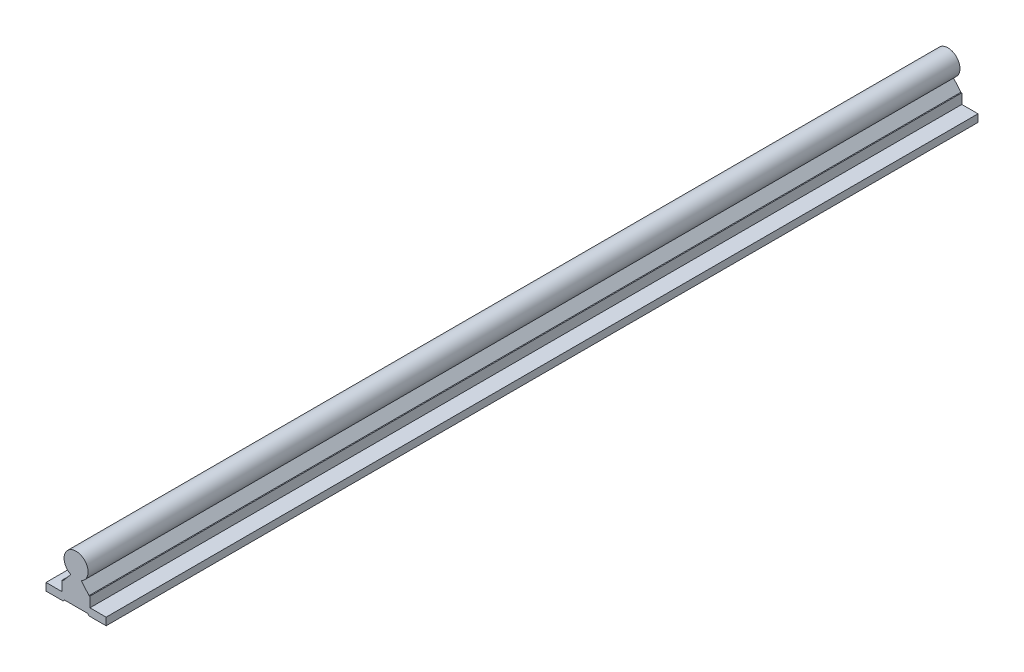
ISO-10303-21;
HEADER;
FILE_DESCRIPTION(('STEP AP214'),'2;1');
FILE_NAME('part.step','',(''),(''),'','','');
FILE_SCHEMA(('AUTOMOTIVE_DESIGN { 1 0 10303 214 1 1 1 1 }'));
ENDSEC;
DATA;
#1=APPLICATION_CONTEXT('core data for automotive mechanical design processes');
#2=APPLICATION_PROTOCOL_DEFINITION('international standard','automotive_design',2000,#1);
#3=PRODUCT_CONTEXT('',#1,'mechanical');
#4=PRODUCT('Part','Part','',(#3));
#5=PRODUCT_RELATED_PRODUCT_CATEGORY('part','',(#4));
#6=PRODUCT_DEFINITION_FORMATION('','',#4);
#7=PRODUCT_DEFINITION_CONTEXT('part definition',#1,'design');
#8=PRODUCT_DEFINITION('design','',#6,#7);
#9=PRODUCT_DEFINITION_SHAPE('','',#8);
#10=(LENGTH_UNIT() NAMED_UNIT(*) SI_UNIT(.MILLI.,.METRE.));
#11=(NAMED_UNIT(*) PLANE_ANGLE_UNIT() SI_UNIT($,.RADIAN.));
#12=(NAMED_UNIT(*) SI_UNIT($,.STERADIAN.) SOLID_ANGLE_UNIT());
#13=UNCERTAINTY_MEASURE_WITH_UNIT(LENGTH_MEASURE(1.E-05),#10,'distance_accuracy_value','');
#14=(GEOMETRIC_REPRESENTATION_CONTEXT(3) GLOBAL_UNCERTAINTY_ASSIGNED_CONTEXT((#13)) GLOBAL_UNIT_ASSIGNED_CONTEXT((#10,
#11,#12)) REPRESENTATION_CONTEXT('',''));
#15=CARTESIAN_POINT('',(0.,0.,0.));
#16=DIRECTION('',(0.,0.,1.));
#17=DIRECTION('',(1.,0.,0.));
#18=AXIS2_PLACEMENT_3D('',#15,#16,#17);
#19=CARTESIAN_POINT('',(0.,25.,580.));
#20=DIRECTION('',(0.,0.,-1.));
#21=DIRECTION('',(-1.,0.,0.));
#22=AXIS2_PLACEMENT_3D('',#19,#20,#21);
#23=CYLINDRICAL_SURFACE('',#22,8.);
#24=CARTESIAN_POINT('',(0.,25.,0.));
#25=DIRECTION('',(0.,0.,1.));
#26=DIRECTION('',(1.,0.,0.));
#27=AXIS2_PLACEMENT_3D('',#24,#25,#26);
#28=CIRCLE('',#27,8.);
#29=CARTESIAN_POINT('',(3.48711915483254,17.8,0.));
#30=VERTEX_POINT('',#29);
#31=CARTESIAN_POINT('',(-3.48711915483254,17.8,0.));
#32=VERTEX_POINT('',#31);
#33=EDGE_CURVE('E179',#30,#32,#28,.T.);
#34=ORIENTED_EDGE('',*,*,#33,.T.);
#35=DIRECTION('',(0.,0.,-1.));
#36=VECTOR('',#35,1.);
#37=CARTESIAN_POINT('',(-3.48711915483254,17.8,580.));
#38=LINE('',#37,#36);
#39=CARTESIAN_POINT('',(-3.48711915483254,17.8,580.));
#40=VERTEX_POINT('',#39);
#41=EDGE_CURVE('E11',#40,#32,#38,.T.);
#42=ORIENTED_EDGE('',*,*,#41,.F.);
#43=CARTESIAN_POINT('',(0.,25.,580.));
#44=DIRECTION('',(0.,0.,1.));
#45=DIRECTION('',(1.,0.,0.));
#46=AXIS2_PLACEMENT_3D('',#43,#44,#45);
#47=CIRCLE('',#46,8.);
#48=CARTESIAN_POINT('',(3.48711915483254,17.8,580.));
#49=VERTEX_POINT('',#48);
#50=EDGE_CURVE('E209',#49,#40,#47,.T.);
#51=ORIENTED_EDGE('',*,*,#50,.F.);
#52=DIRECTION('',(0.,0.,-1.));
#53=VECTOR('',#52,1.);
#54=CARTESIAN_POINT('',(3.48711915483254,17.8,580.));
#55=LINE('',#54,#53);
#56=EDGE_CURVE('E175',#49,#30,#55,.T.);
#57=ORIENTED_EDGE('',*,*,#56,.T.);
#58=EDGE_LOOP('',(#34,#42,#51,#57));
#59=FACE_BOUND('',#58,.T.);
#60=ADVANCED_FACE('F35',(#59),#23,.T.);
#61=CARTESIAN_POINT('',(-3.48711915483254,17.8,580.));
#62=DIRECTION('',(0.766044443118977,-0.642787609686541,0.));
#63=DIRECTION('',(0.642787609686541,0.766044443118977,0.));
#64=AXIS2_PLACEMENT_3D('',#61,#62,#63);
#65=PLANE('',#64);
#66=DIRECTION('',(-0.64278760968654,-0.766044443118977,0.));
#67=VECTOR('',#66,1.);
#68=CARTESIAN_POINT('',(-3.48711915483254,17.8,0.));
#69=LINE('',#68,#67);
#70=CARTESIAN_POINT('',(-8.60562690501396,11.7,0.));
#71=VERTEX_POINT('',#70);
#72=EDGE_CURVE('E182',#32,#71,#69,.T.);
#73=ORIENTED_EDGE('',*,*,#72,.T.);
#74=DIRECTION('',(0.,0.,-1.));
#75=VECTOR('',#74,1.);
#76=CARTESIAN_POINT('',(-8.60562690501396,11.7,580.));
#77=LINE('',#76,#75);
#78=CARTESIAN_POINT('',(-8.60562690501396,11.7,580.));
#79=VERTEX_POINT('',#78);
#80=EDGE_CURVE('E43',#79,#71,#77,.T.);
#81=ORIENTED_EDGE('',*,*,#80,.F.);
#82=DIRECTION('',(-0.64278760968654,-0.766044443118977,0.));
#83=VECTOR('',#82,1.);
#84=CARTESIAN_POINT('',(-3.48711915483254,17.8,580.));
#85=LINE('',#84,#83);
#86=EDGE_CURVE('E118',#40,#79,#85,.T.);
#87=ORIENTED_EDGE('',*,*,#86,.F.);
#88=ORIENTED_EDGE('',*,*,#41,.T.);
#89=EDGE_LOOP('',(#73,#81,#87,#88));
#90=FACE_BOUND('',#89,.T.);
#91=ADVANCED_FACE('F307',(#90),#65,.F.);
#92=CARTESIAN_POINT('',(-8.60562690501396,11.7,580.));
#93=DIRECTION('',(0.,-1.,0.));
#94=DIRECTION('',(0.,0.,-1.));
#95=AXIS2_PLACEMENT_3D('',#92,#93,#94);
#96=PLANE('',#95);
#97=DIRECTION('',(-1.,0.,0.));
#98=VECTOR('',#97,1.);
#99=CARTESIAN_POINT('',(-8.60562690501396,11.7,0.));
#100=LINE('',#99,#98);
#101=CARTESIAN_POINT('',(-9.25,11.7,0.));
#102=VERTEX_POINT('',#101);
#103=EDGE_CURVE('E184',#71,#102,#100,.T.);
#104=ORIENTED_EDGE('',*,*,#103,.T.);
#105=DIRECTION('',(0.,0.,-1.));
#106=VECTOR('',#105,1.);
#107=CARTESIAN_POINT('',(-9.25,11.7,580.));
#108=LINE('',#107,#106);
#109=CARTESIAN_POINT('',(-9.25,11.7,580.));
#110=VERTEX_POINT('',#109);
#111=EDGE_CURVE('E240',#110,#102,#108,.T.);
#112=ORIENTED_EDGE('',*,*,#111,.F.);
#113=DIRECTION('',(-1.,0.,0.));
#114=VECTOR('',#113,1.);
#115=CARTESIAN_POINT('',(-8.60562690501396,11.7,580.));
#116=LINE('',#115,#114);
#117=EDGE_CURVE('E248',#79,#110,#116,.T.);
#118=ORIENTED_EDGE('',*,*,#117,.F.);
#119=ORIENTED_EDGE('',*,*,#80,.T.);
#120=EDGE_LOOP('',(#104,#112,#118,#119));
#121=FACE_BOUND('',#120,.T.);
#122=ADVANCED_FACE('F246',(#121),#96,.F.);
#123=CARTESIAN_POINT('',(-9.25,11.7,580.));
#124=DIRECTION('',(1.,0.,0.));
#125=DIRECTION('',(0.,0.,-1.));
#126=AXIS2_PLACEMENT_3D('',#123,#124,#125);
#127=PLANE('',#126);
#128=DIRECTION('',(0.,-1.,0.));
#129=VECTOR('',#128,1.);
#130=CARTESIAN_POINT('',(-9.25,11.7,0.));
#131=LINE('',#130,#129);
#132=CARTESIAN_POINT('',(-9.25,5.,0.));
#133=VERTEX_POINT('',#132);
#134=EDGE_CURVE('E186',#102,#133,#131,.T.);
#135=ORIENTED_EDGE('',*,*,#134,.T.);
#136=DIRECTION('',(0.,0.,-1.));
#137=VECTOR('',#136,1.);
#138=CARTESIAN_POINT('',(-9.25,5.,580.));
#139=LINE('',#138,#137);
#140=CARTESIAN_POINT('',(-9.25,5.,580.));
#141=VERTEX_POINT('',#140);
#142=EDGE_CURVE('E237',#141,#133,#139,.T.);
#143=ORIENTED_EDGE('',*,*,#142,.F.);
#144=DIRECTION('',(0.,-1.,0.));
#145=VECTOR('',#144,1.);
#146=CARTESIAN_POINT('',(-9.25,11.7,580.));
#147=LINE('',#146,#145);
#148=EDGE_CURVE('E266',#110,#141,#147,.T.);
#149=ORIENTED_EDGE('',*,*,#148,.F.);
#150=ORIENTED_EDGE('',*,*,#111,.T.);
#151=EDGE_LOOP('',(#135,#143,#149,#150));
#152=FACE_BOUND('',#151,.T.);
#153=ADVANCED_FACE('F257',(#152),#127,.F.);
#154=CARTESIAN_POINT('',(-9.25,5.,580.));
#155=DIRECTION('',(0.,-1.,0.));
#156=DIRECTION('',(1.,0.,0.));
#157=AXIS2_PLACEMENT_3D('',#154,#155,#156);
#158=PLANE('',#157);
#159=DIRECTION('',(-1.,0.,0.));
#160=VECTOR('',#159,1.);
#161=CARTESIAN_POINT('',(-9.25,5.,0.));
#162=LINE('',#161,#160);
#163=CARTESIAN_POINT('',(-20.,5.,0.));
#164=VERTEX_POINT('',#163);
#165=EDGE_CURVE('E188',#133,#164,#162,.T.);
#166=ORIENTED_EDGE('',*,*,#165,.T.);
#167=DIRECTION('',(0.,0.,-1.));
#168=VECTOR('',#167,1.);
#169=CARTESIAN_POINT('',(-20.,5.,580.));
#170=LINE('',#169,#168);
#171=CARTESIAN_POINT('',(-20.,5.,580.));
#172=VERTEX_POINT('',#171);
#173=EDGE_CURVE('E234',#172,#164,#170,.T.);
#174=ORIENTED_EDGE('',*,*,#173,.F.);
#175=DIRECTION('',(-1.,0.,0.));
#176=VECTOR('',#175,1.);
#177=CARTESIAN_POINT('',(-9.25,5.,580.));
#178=LINE('',#177,#176);
#179=EDGE_CURVE('E263',#141,#172,#178,.T.);
#180=ORIENTED_EDGE('',*,*,#179,.F.);
#181=ORIENTED_EDGE('',*,*,#142,.T.);
#182=EDGE_LOOP('',(#166,#174,#180,#181));
#183=FACE_BOUND('',#182,.T.);
#184=ADVANCED_FACE('F261',(#183),#158,.F.);
#185=CARTESIAN_POINT('',(-20.,5.,580.));
#186=DIRECTION('',(1.,0.,0.));
#187=DIRECTION('',(0.,1.,0.));
#188=AXIS2_PLACEMENT_3D('',#185,#186,#187);
#189=PLANE('',#188);
#190=DIRECTION('',(0.,-1.,0.));
#191=VECTOR('',#190,1.);
#192=CARTESIAN_POINT('',(-20.,5.,0.));
#193=LINE('',#192,#191);
#194=CARTESIAN_POINT('',(-20.,0.,0.));
#195=VERTEX_POINT('',#194);
#196=EDGE_CURVE('E190',#164,#195,#193,.T.);
#197=ORIENTED_EDGE('',*,*,#196,.T.);
#198=DIRECTION('',(0.,0.,-1.));
#199=VECTOR('',#198,1.);
#200=CARTESIAN_POINT('',(-20.,0.,580.));
#201=LINE('',#200,#199);
#202=CARTESIAN_POINT('',(-20.,0.,580.));
#203=VERTEX_POINT('',#202);
#204=EDGE_CURVE('E231',#203,#195,#201,.T.);
#205=ORIENTED_EDGE('',*,*,#204,.F.);
#206=DIRECTION('',(0.,-1.,0.));
#207=VECTOR('',#206,1.);
#208=CARTESIAN_POINT('',(-20.,5.,580.));
#209=LINE('',#208,#207);
#210=EDGE_CURVE('E265',#172,#203,#209,.T.);
#211=ORIENTED_EDGE('',*,*,#210,.F.);
#212=ORIENTED_EDGE('',*,*,#173,.T.);
#213=EDGE_LOOP('',(#197,#205,#211,#212));
#214=FACE_BOUND('',#213,.T.);
#215=ADVANCED_FACE('F320',(#214),#189,.F.);
#216=CARTESIAN_POINT('',(-20.,0.,580.));
#217=DIRECTION('',(0.,1.,0.));
#218=DIRECTION('',(-1.,0.,0.));
#219=AXIS2_PLACEMENT_3D('',#216,#217,#218);
#220=PLANE('',#219);
#221=DIRECTION('',(1.,0.,0.));
#222=VECTOR('',#221,1.);
#223=CARTESIAN_POINT('',(-20.,0.,0.));
#224=LINE('',#223,#222);
#225=CARTESIAN_POINT('',(-8.60562690501397,0.,0.));
#226=VERTEX_POINT('',#225);
#227=EDGE_CURVE('E192',#195,#226,#224,.T.);
#228=ORIENTED_EDGE('',*,*,#227,.T.);
#229=DIRECTION('',(0.,0.,-1.));
#230=VECTOR('',#229,1.);
#231=CARTESIAN_POINT('',(-8.60562690501397,0.,580.));
#232=LINE('',#231,#230);
#233=CARTESIAN_POINT('',(-8.60562690501397,0.,580.));
#234=VERTEX_POINT('',#233);
#235=EDGE_CURVE('E228',#234,#226,#232,.T.);
#236=ORIENTED_EDGE('',*,*,#235,.F.);
#237=DIRECTION('',(1.,0.,0.));
#238=VECTOR('',#237,1.);
#239=CARTESIAN_POINT('',(-20.,0.,580.));
#240=LINE('',#239,#238);
#241=EDGE_CURVE('E268',#203,#234,#240,.T.);
#242=ORIENTED_EDGE('',*,*,#241,.F.);
#243=ORIENTED_EDGE('',*,*,#204,.T.);
#244=EDGE_LOOP('',(#228,#236,#242,#243));
#245=FACE_BOUND('',#244,.T.);
#246=ADVANCED_FACE('F323',(#245),#220,.F.);
#247=CARTESIAN_POINT('',(-8.60562690501397,0.,580.));
#248=DIRECTION('',(-0.766044443118977,0.642787609686541,0.));
#249=DIRECTION('',(-0.642787609686541,-0.766044443118977,0.));
#250=AXIS2_PLACEMENT_3D('',#247,#248,#249);
#251=PLANE('',#250);
#252=DIRECTION('',(0.642787609686541,0.766044443118977,0.));
#253=VECTOR('',#252,1.);
#254=CARTESIAN_POINT('',(-8.60562690501397,0.,0.));
#255=LINE('',#254,#253);
#256=CARTESIAN_POINT('',(-7.76652727383668,1.00000000000001,0.));
#257=VERTEX_POINT('',#256);
#258=EDGE_CURVE('E194',#226,#257,#255,.T.);
#259=ORIENTED_EDGE('',*,*,#258,.T.);
#260=DIRECTION('',(0.,0.,-1.));
#261=VECTOR('',#260,1.);
#262=CARTESIAN_POINT('',(-7.76652727383668,1.00000000000001,580.));
#263=LINE('',#262,#261);
#264=CARTESIAN_POINT('',(-7.76652727383668,1.00000000000001,580.));
#265=VERTEX_POINT('',#264);
#266=EDGE_CURVE('E225',#265,#257,#263,.T.);
#267=ORIENTED_EDGE('',*,*,#266,.F.);
#268=DIRECTION('',(0.642787609686541,0.766044443118977,0.));
#269=VECTOR('',#268,1.);
#270=CARTESIAN_POINT('',(-8.60562690501397,0.,580.));
#271=LINE('',#270,#269);
#272=EDGE_CURVE('E274',#234,#265,#271,.T.);
#273=ORIENTED_EDGE('',*,*,#272,.F.);
#274=ORIENTED_EDGE('',*,*,#235,.T.);
#275=EDGE_LOOP('',(#259,#267,#273,#274));
#276=FACE_BOUND('',#275,.T.);
#277=ADVANCED_FACE('F327',(#276),#251,.F.);
#278=CARTESIAN_POINT('',(-7.76652727383668,1.00000000000001,580.));
#279=DIRECTION('',(0.,1.,0.));
#280=DIRECTION('',(0.,0.,1.));
#281=AXIS2_PLACEMENT_3D('',#278,#279,#280);
#282=PLANE('',#281);
#283=DIRECTION('',(1.,0.,0.));
#284=VECTOR('',#283,1.);
#285=CARTESIAN_POINT('',(-7.76652727383668,1.00000000000001,0.));
#286=LINE('',#285,#284);
#287=CARTESIAN_POINT('',(7.76652727383668,1.00000000000001,0.));
#288=VERTEX_POINT('',#287);
#289=EDGE_CURVE('E196',#257,#288,#286,.T.);
#290=ORIENTED_EDGE('',*,*,#289,.T.);
#291=DIRECTION('',(0.,0.,-1.));
#292=VECTOR('',#291,1.);
#293=CARTESIAN_POINT('',(7.76652727383668,1.00000000000001,580.));
#294=LINE('',#293,#292);
#295=CARTESIAN_POINT('',(7.76652727383668,1.00000000000001,580.));
#296=VERTEX_POINT('',#295);
#297=EDGE_CURVE('E222',#296,#288,#294,.T.);
#298=ORIENTED_EDGE('',*,*,#297,.F.);
#299=DIRECTION('',(1.,0.,0.));
#300=VECTOR('',#299,1.);
#301=CARTESIAN_POINT('',(-7.76652727383668,1.00000000000001,580.));
#302=LINE('',#301,#300);
#303=EDGE_CURVE('E276',#265,#296,#302,.T.);
#304=ORIENTED_EDGE('',*,*,#303,.F.);
#305=ORIENTED_EDGE('',*,*,#266,.T.);
#306=EDGE_LOOP('',(#290,#298,#304,#305));
#307=FACE_BOUND('',#306,.T.);
#308=ADVANCED_FACE('F331',(#307),#282,.F.);
#309=CARTESIAN_POINT('',(8.60562690501397,0.,580.));
#310=DIRECTION('',(0.766044443118977,0.642787609686541,0.));
#311=DIRECTION('',(-0.642787609686541,0.766044443118977,0.));
#312=AXIS2_PLACEMENT_3D('',#309,#310,#311);
#313=PLANE('',#312);
#314=DIRECTION('',(0.642787609686541,-0.766044443118977,0.));
#315=VECTOR('',#314,1.);
#316=CARTESIAN_POINT('',(8.60562690501397,0.,0.));
#317=LINE('',#316,#315);
#318=CARTESIAN_POINT('',(8.60562690501397,0.,0.));
#319=VERTEX_POINT('',#318);
#320=EDGE_CURVE('E198',#288,#319,#317,.T.);
#321=ORIENTED_EDGE('',*,*,#320,.T.);
#322=DIRECTION('',(0.,0.,-1.));
#323=VECTOR('',#322,1.);
#324=CARTESIAN_POINT('',(8.60562690501397,0.,580.));
#325=LINE('',#324,#323);
#326=CARTESIAN_POINT('',(8.60562690501397,0.,580.));
#327=VERTEX_POINT('',#326);
#328=EDGE_CURVE('E219',#327,#319,#325,.T.);
#329=ORIENTED_EDGE('',*,*,#328,.F.);
#330=DIRECTION('',(0.642787609686541,-0.766044443118977,0.));
#331=VECTOR('',#330,1.);
#332=CARTESIAN_POINT('',(8.60562690501397,0.,580.));
#333=LINE('',#332,#331);
#334=EDGE_CURVE('E278',#296,#327,#333,.T.);
#335=ORIENTED_EDGE('',*,*,#334,.F.);
#336=ORIENTED_EDGE('',*,*,#297,.T.);
#337=EDGE_LOOP('',(#321,#329,#335,#336));
#338=FACE_BOUND('',#337,.T.);
#339=ADVANCED_FACE('F335',(#338),#313,.F.);
#340=CARTESIAN_POINT('',(20.,0.,580.));
#341=DIRECTION('',(0.,1.,0.));
#342=DIRECTION('',(-1.,0.,0.));
#343=AXIS2_PLACEMENT_3D('',#340,#341,#342);
#344=PLANE('',#343);
#345=DIRECTION('',(1.,0.,0.));
#346=VECTOR('',#345,1.);
#347=CARTESIAN_POINT('',(20.,0.,0.));
#348=LINE('',#347,#346);
#349=CARTESIAN_POINT('',(20.,0.,0.));
#350=VERTEX_POINT('',#349);
#351=EDGE_CURVE('E200',#319,#350,#348,.T.);
#352=ORIENTED_EDGE('',*,*,#351,.T.);
#353=DIRECTION('',(0.,0.,-1.));
#354=VECTOR('',#353,1.);
#355=CARTESIAN_POINT('',(20.,0.,580.));
#356=LINE('',#355,#354);
#357=CARTESIAN_POINT('',(20.,0.,580.));
#358=VERTEX_POINT('',#357);
#359=EDGE_CURVE('E216',#358,#350,#356,.T.);
#360=ORIENTED_EDGE('',*,*,#359,.F.);
#361=DIRECTION('',(1.,0.,0.));
#362=VECTOR('',#361,1.);
#363=CARTESIAN_POINT('',(20.,0.,580.));
#364=LINE('',#363,#362);
#365=EDGE_CURVE('E280',#327,#358,#364,.T.);
#366=ORIENTED_EDGE('',*,*,#365,.F.);
#367=ORIENTED_EDGE('',*,*,#328,.T.);
#368=EDGE_LOOP('',(#352,#360,#366,#367));
#369=FACE_BOUND('',#368,.T.);
#370=ADVANCED_FACE('F339',(#369),#344,.F.);
#371=CARTESIAN_POINT('',(20.,5.,580.));
#372=DIRECTION('',(-1.,0.,0.));
#373=DIRECTION('',(0.,-1.,0.));
#374=AXIS2_PLACEMENT_3D('',#371,#372,#373);
#375=PLANE('',#374);
#376=DIRECTION('',(0.,1.,0.));
#377=VECTOR('',#376,1.);
#378=CARTESIAN_POINT('',(20.,5.,0.));
#379=LINE('',#378,#377);
#380=CARTESIAN_POINT('',(20.,5.,0.));
#381=VERTEX_POINT('',#380);
#382=EDGE_CURVE('E202',#350,#381,#379,.T.);
#383=ORIENTED_EDGE('',*,*,#382,.T.);
#384=DIRECTION('',(0.,0.,-1.));
#385=VECTOR('',#384,1.);
#386=CARTESIAN_POINT('',(20.,5.,580.));
#387=LINE('',#386,#385);
#388=CARTESIAN_POINT('',(20.,5.,580.));
#389=VERTEX_POINT('',#388);
#390=EDGE_CURVE('E213',#389,#381,#387,.T.);
#391=ORIENTED_EDGE('',*,*,#390,.F.);
#392=DIRECTION('',(0.,1.,0.));
#393=VECTOR('',#392,1.);
#394=CARTESIAN_POINT('',(20.,5.,580.));
#395=LINE('',#394,#393);
#396=EDGE_CURVE('E282',#358,#389,#395,.T.);
#397=ORIENTED_EDGE('',*,*,#396,.F.);
#398=ORIENTED_EDGE('',*,*,#359,.T.);
#399=EDGE_LOOP('',(#383,#391,#397,#398));
#400=FACE_BOUND('',#399,.T.);
#401=ADVANCED_FACE('F288',(#400),#375,.F.);
#402=CARTESIAN_POINT('',(9.25,5.,580.));
#403=DIRECTION('',(0.,-1.,0.));
#404=DIRECTION('',(1.,0.,0.));
#405=AXIS2_PLACEMENT_3D('',#402,#403,#404);
#406=PLANE('',#405);
#407=DIRECTION('',(-1.,0.,0.));
#408=VECTOR('',#407,1.);
#409=CARTESIAN_POINT('',(9.25,5.,0.));
#410=LINE('',#409,#408);
#411=CARTESIAN_POINT('',(9.25,5.,0.));
#412=VERTEX_POINT('',#411);
#413=EDGE_CURVE('E204',#381,#412,#410,.T.);
#414=ORIENTED_EDGE('',*,*,#413,.T.);
#415=DIRECTION('',(0.,0.,-1.));
#416=VECTOR('',#415,1.);
#417=CARTESIAN_POINT('',(9.25,5.,580.));
#418=LINE('',#417,#416);
#419=CARTESIAN_POINT('',(9.25,5.,580.));
#420=VERTEX_POINT('',#419);
#421=EDGE_CURVE('E170',#420,#412,#418,.T.);
#422=ORIENTED_EDGE('',*,*,#421,.F.);
#423=DIRECTION('',(-1.,0.,0.));
#424=VECTOR('',#423,1.);
#425=CARTESIAN_POINT('',(9.25,5.,580.));
#426=LINE('',#425,#424);
#427=EDGE_CURVE('E161',#389,#420,#426,.T.);
#428=ORIENTED_EDGE('',*,*,#427,.F.);
#429=ORIENTED_EDGE('',*,*,#390,.T.);
#430=EDGE_LOOP('',(#414,#422,#428,#429));
#431=FACE_BOUND('',#430,.T.);
#432=ADVANCED_FACE('F292',(#431),#406,.F.);
#433=CARTESIAN_POINT('',(9.25,11.7,580.));
#434=DIRECTION('',(-1.,0.,0.));
#435=DIRECTION('',(0.,0.,1.));
#436=AXIS2_PLACEMENT_3D('',#433,#434,#435);
#437=PLANE('',#436);
#438=DIRECTION('',(0.,1.,0.));
#439=VECTOR('',#438,1.);
#440=CARTESIAN_POINT('',(9.25,11.7,0.));
#441=LINE('',#440,#439);
#442=CARTESIAN_POINT('',(9.25,11.7,0.));
#443=VERTEX_POINT('',#442);
#444=EDGE_CURVE('E169',#412,#443,#441,.T.);
#445=ORIENTED_EDGE('',*,*,#444,.T.);
#446=DIRECTION('',(0.,0.,-1.));
#447=VECTOR('',#446,1.);
#448=CARTESIAN_POINT('',(9.25,11.7,580.));
#449=LINE('',#448,#447);
#450=CARTESIAN_POINT('',(9.25,11.7,580.));
#451=VERTEX_POINT('',#450);
#452=EDGE_CURVE('E166',#451,#443,#449,.T.);
#453=ORIENTED_EDGE('',*,*,#452,.F.);
#454=DIRECTION('',(0.,1.,0.));
#455=VECTOR('',#454,1.);
#456=CARTESIAN_POINT('',(9.25,11.7,580.));
#457=LINE('',#456,#455);
#458=EDGE_CURVE('E155',#420,#451,#457,.T.);
#459=ORIENTED_EDGE('',*,*,#458,.F.);
#460=ORIENTED_EDGE('',*,*,#421,.T.);
#461=EDGE_LOOP('',(#445,#453,#459,#460));
#462=FACE_BOUND('',#461,.T.);
#463=ADVANCED_FACE('F167',(#462),#437,.F.);
#464=CARTESIAN_POINT('',(8.60562690501396,11.7,580.));
#465=DIRECTION('',(0.,-1.,0.));
#466=DIRECTION('',(0.,0.,-1.));
#467=AXIS2_PLACEMENT_3D('',#464,#465,#466);
#468=PLANE('',#467);
#469=DIRECTION('',(-1.,0.,0.));
#470=VECTOR('',#469,1.);
#471=CARTESIAN_POINT('',(8.60562690501396,11.7,0.));
#472=LINE('',#471,#470);
#473=CARTESIAN_POINT('',(8.60562690501396,11.7,0.));
#474=VERTEX_POINT('',#473);
#475=EDGE_CURVE('E104',#443,#474,#472,.T.);
#476=ORIENTED_EDGE('',*,*,#475,.T.);
#477=DIRECTION('',(0.,0.,-1.));
#478=VECTOR('',#477,1.);
#479=CARTESIAN_POINT('',(8.60562690501396,11.7,580.));
#480=LINE('',#479,#478);
#481=CARTESIAN_POINT('',(8.60562690501396,11.7,580.));
#482=VERTEX_POINT('',#481);
#483=EDGE_CURVE('E171',#482,#474,#480,.T.);
#484=ORIENTED_EDGE('',*,*,#483,.F.);
#485=DIRECTION('',(-1.,0.,0.));
#486=VECTOR('',#485,1.);
#487=CARTESIAN_POINT('',(8.60562690501396,11.7,580.));
#488=LINE('',#487,#486);
#489=EDGE_CURVE('E159',#451,#482,#488,.T.);
#490=ORIENTED_EDGE('',*,*,#489,.F.);
#491=ORIENTED_EDGE('',*,*,#452,.T.);
#492=EDGE_LOOP('',(#476,#484,#490,#491));
#493=FACE_BOUND('',#492,.T.);
#494=ADVANCED_FACE('F173',(#493),#468,.F.);
#495=CARTESIAN_POINT('',(3.48711915483254,17.8,580.));
#496=DIRECTION('',(-0.766044443118977,-0.642787609686541,0.));
#497=DIRECTION('',(0.642787609686541,-0.766044443118977,0.));
#498=AXIS2_PLACEMENT_3D('',#495,#496,#497);
#499=PLANE('',#498);
#500=DIRECTION('',(-0.64278760968654,0.766044443118977,0.));
#501=VECTOR('',#500,1.);
#502=CARTESIAN_POINT('',(3.48711915483254,17.8,0.));
#503=LINE('',#502,#501);
#504=EDGE_CURVE('E110',#474,#30,#503,.T.);
#505=ORIENTED_EDGE('',*,*,#504,.T.);
#506=ORIENTED_EDGE('',*,*,#56,.F.);
#507=DIRECTION('',(-0.64278760968654,0.766044443118977,0.));
#508=VECTOR('',#507,1.);
#509=CARTESIAN_POINT('',(3.48711915483254,17.8,580.));
#510=LINE('',#509,#508);
#511=EDGE_CURVE('E51',#482,#49,#510,.T.);
#512=ORIENTED_EDGE('',*,*,#511,.F.);
#513=ORIENTED_EDGE('',*,*,#483,.T.);
#514=EDGE_LOOP('',(#505,#506,#512,#513));
#515=FACE_BOUND('',#514,.T.);
#516=ADVANCED_FACE('F296',(#515),#499,.F.);
#517=CARTESIAN_POINT('',(0.,25.,580.));
#518=DIRECTION('',(0.,0.,1.));
#519=DIRECTION('',(1.,0.,0.));
#520=AXIS2_PLACEMENT_3D('',#517,#518,#519);
#521=PLANE('',#520);
#522=ORIENTED_EDGE('',*,*,#50,.T.);
#523=ORIENTED_EDGE('',*,*,#86,.T.);
#524=ORIENTED_EDGE('',*,*,#117,.T.);
#525=ORIENTED_EDGE('',*,*,#148,.T.);
#526=ORIENTED_EDGE('',*,*,#179,.T.);
#527=ORIENTED_EDGE('',*,*,#210,.T.);
#528=ORIENTED_EDGE('',*,*,#241,.T.);
#529=ORIENTED_EDGE('',*,*,#272,.T.);
#530=ORIENTED_EDGE('',*,*,#303,.T.);
#531=ORIENTED_EDGE('',*,*,#334,.T.);
#532=ORIENTED_EDGE('',*,*,#365,.T.);
#533=ORIENTED_EDGE('',*,*,#396,.T.);
#534=ORIENTED_EDGE('',*,*,#427,.T.);
#535=ORIENTED_EDGE('',*,*,#458,.T.);
#536=ORIENTED_EDGE('',*,*,#489,.T.);
#537=ORIENTED_EDGE('',*,*,#511,.T.);
#538=EDGE_LOOP('',(#522,#523,#524,#525,#526,#527,#528,#529,#530,#531,#532,#533,#534,#535,#536,#537));
#539=FACE_BOUND('',#538,.T.);
#540=ADVANCED_FACE('F157',(#539),#521,.T.);
#541=CARTESIAN_POINT('',(0.,25.,0.));
#542=DIRECTION('',(0.,0.,1.));
#543=DIRECTION('',(1.,0.,0.));
#544=AXIS2_PLACEMENT_3D('',#541,#542,#543);
#545=PLANE('',#544);
#546=ORIENTED_EDGE('',*,*,#33,.F.);
#547=ORIENTED_EDGE('',*,*,#504,.F.);
#548=ORIENTED_EDGE('',*,*,#475,.F.);
#549=ORIENTED_EDGE('',*,*,#444,.F.);
#550=ORIENTED_EDGE('',*,*,#413,.F.);
#551=ORIENTED_EDGE('',*,*,#382,.F.);
#552=ORIENTED_EDGE('',*,*,#351,.F.);
#553=ORIENTED_EDGE('',*,*,#320,.F.);
#554=ORIENTED_EDGE('',*,*,#289,.F.);
#555=ORIENTED_EDGE('',*,*,#258,.F.);
#556=ORIENTED_EDGE('',*,*,#227,.F.);
#557=ORIENTED_EDGE('',*,*,#196,.F.);
#558=ORIENTED_EDGE('',*,*,#165,.F.);
#559=ORIENTED_EDGE('',*,*,#134,.F.);
#560=ORIENTED_EDGE('',*,*,#103,.F.);
#561=ORIENTED_EDGE('',*,*,#72,.F.);
#562=EDGE_LOOP('',(#546,#547,#548,#549,#550,#551,#552,#553,#554,#555,#556,#557,#558,#559,#560,#561));
#563=FACE_BOUND('',#562,.T.);
#564=ADVANCED_FACE('F252',(#563),#545,.F.);
#565=CLOSED_SHELL('',(#60,#91,#122,#153,#184,#215,#246,#277,#308,#339,#370,#401,#432,#463,#494,
#516,#540,#564));
#566=MANIFOLD_SOLID_BREP('B2',#565);
#567=ADVANCED_BREP_SHAPE_REPRESENTATION('',(#18,#566),#14);
#568=SHAPE_DEFINITION_REPRESENTATION(#9,#567);
ENDSEC;
END-ISO-10303-21;
